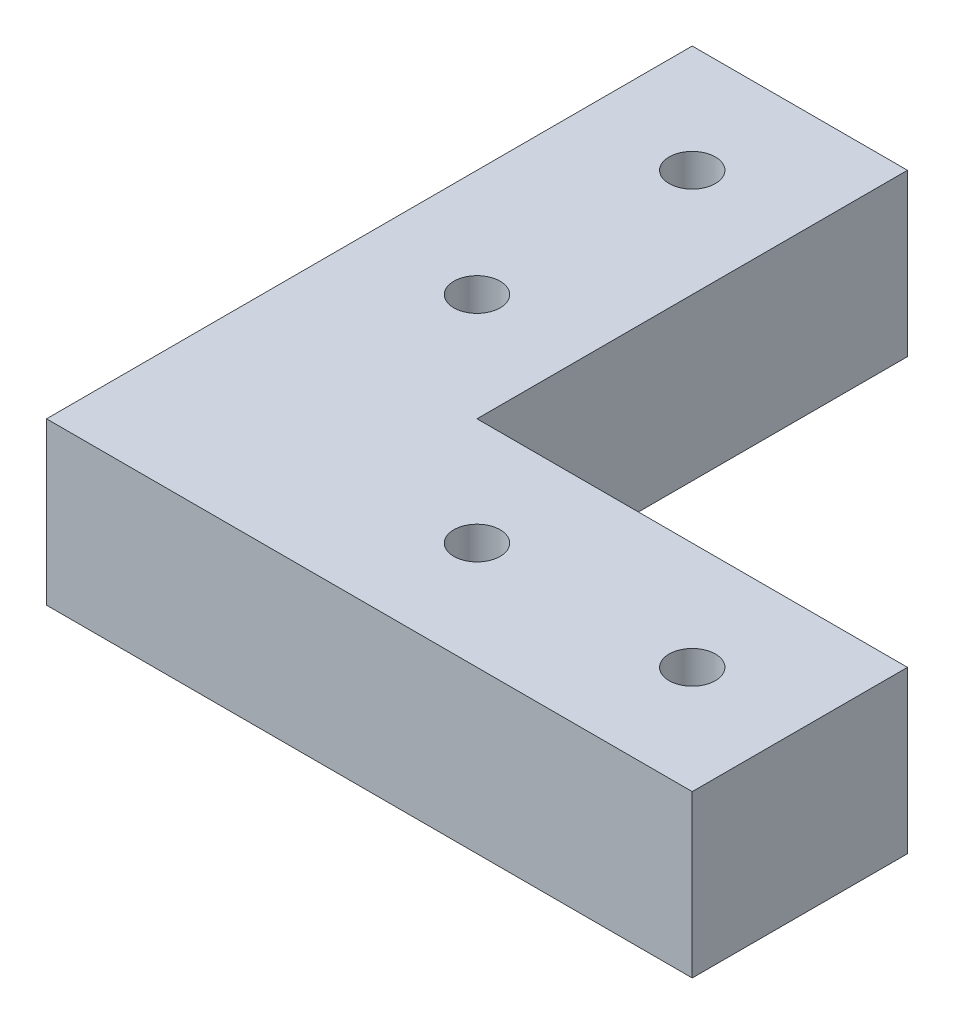
ISO-10303-21;
HEADER;
FILE_DESCRIPTION(('STEP AP214'),'2;1');
FILE_NAME('part.step','',(''),(''),'','','');
FILE_SCHEMA(('AUTOMOTIVE_DESIGN { 1 0 10303 214 1 1 1 1 }'));
ENDSEC;
DATA;
#1=APPLICATION_CONTEXT('core data for automotive mechanical design processes');
#2=APPLICATION_PROTOCOL_DEFINITION('international standard','automotive_design',2000,#1);
#3=PRODUCT_CONTEXT('',#1,'mechanical');
#4=PRODUCT('Part','Part','',(#3));
#5=PRODUCT_RELATED_PRODUCT_CATEGORY('part','',(#4));
#6=PRODUCT_DEFINITION_FORMATION('','',#4);
#7=PRODUCT_DEFINITION_CONTEXT('part definition',#1,'design');
#8=PRODUCT_DEFINITION('design','',#6,#7);
#9=PRODUCT_DEFINITION_SHAPE('','',#8);
#10=(LENGTH_UNIT() NAMED_UNIT(*) SI_UNIT(.MILLI.,.METRE.));
#11=(NAMED_UNIT(*) PLANE_ANGLE_UNIT() SI_UNIT($,.RADIAN.));
#12=(NAMED_UNIT(*) SI_UNIT($,.STERADIAN.) SOLID_ANGLE_UNIT());
#13=UNCERTAINTY_MEASURE_WITH_UNIT(LENGTH_MEASURE(1.E-05),#10,'distance_accuracy_value','');
#14=(GEOMETRIC_REPRESENTATION_CONTEXT(3) GLOBAL_UNCERTAINTY_ASSIGNED_CONTEXT((#13)) GLOBAL_UNIT_ASSIGNED_CONTEXT((#10,
#11,#12)) REPRESENTATION_CONTEXT('',''));
#15=CARTESIAN_POINT('',(0.,0.,0.));
#16=DIRECTION('',(0.,0.,1.));
#17=DIRECTION('',(1.,0.,0.));
#18=AXIS2_PLACEMENT_3D('',#15,#16,#17);
#19=CARTESIAN_POINT('',(0.,15.,0.));
#20=DIRECTION('',(0.,1.,0.));
#21=DIRECTION('',(0.,0.,1.));
#22=AXIS2_PLACEMENT_3D('',#19,#20,#21);
#23=PLANE('',#22);
#24=CARTESIAN_POINT('',(10.,15.,-50.));
#25=DIRECTION('',(0.,1.,0.));
#26=DIRECTION('',(0.,0.,1.));
#27=AXIS2_PLACEMENT_3D('',#24,#25,#26);
#28=CIRCLE('',#27,2.15);
#29=CARTESIAN_POINT('',(10.,15.,-47.85));
#30=VERTEX_POINT('',#29);
#31=EDGE_CURVE('E195',#30,#30,#28,.T.);
#32=ORIENTED_EDGE('',*,*,#31,.F.);
#33=EDGE_LOOP('',(#32));
#34=FACE_BOUND('',#33,.T.);
#35=CARTESIAN_POINT('',(50.,15.,-10.));
#36=DIRECTION('',(0.,1.,0.));
#37=DIRECTION('',(0.,0.,1.));
#38=AXIS2_PLACEMENT_3D('',#35,#36,#37);
#39=CIRCLE('',#38,2.15);
#40=CARTESIAN_POINT('',(50.,15.,-7.85));
#41=VERTEX_POINT('',#40);
#42=EDGE_CURVE('E128',#41,#41,#39,.T.);
#43=ORIENTED_EDGE('',*,*,#42,.F.);
#44=EDGE_LOOP('',(#43));
#45=FACE_BOUND('',#44,.T.);
#46=DIRECTION('',(0.,0.,1.));
#47=VECTOR('',#46,1.);
#48=CARTESIAN_POINT('',(0.,15.,-60.));
#49=LINE('',#48,#47);
#50=CARTESIAN_POINT('',(0.,15.,-60.));
#51=VERTEX_POINT('',#50);
#52=CARTESIAN_POINT('',(0.,15.,0.));
#53=VERTEX_POINT('',#52);
#54=EDGE_CURVE('E135',#51,#53,#49,.T.);
#55=ORIENTED_EDGE('',*,*,#54,.T.);
#56=DIRECTION('',(1.,0.,0.));
#57=VECTOR('',#56,1.);
#58=CARTESIAN_POINT('',(0.,15.,0.));
#59=LINE('',#58,#57);
#60=CARTESIAN_POINT('',(60.,15.,0.));
#61=VERTEX_POINT('',#60);
#62=EDGE_CURVE('E93',#53,#61,#59,.T.);
#63=ORIENTED_EDGE('',*,*,#62,.T.);
#64=DIRECTION('',(0.,0.,-1.));
#65=VECTOR('',#64,1.);
#66=CARTESIAN_POINT('',(60.,15.,0.));
#67=LINE('',#66,#65);
#68=CARTESIAN_POINT('',(60.,15.,-20.));
#69=VERTEX_POINT('',#68);
#70=EDGE_CURVE('E106',#61,#69,#67,.T.);
#71=ORIENTED_EDGE('',*,*,#70,.T.);
#72=DIRECTION('',(-1.,0.,0.));
#73=VECTOR('',#72,1.);
#74=CARTESIAN_POINT('',(60.,15.,-20.));
#75=LINE('',#74,#73);
#76=CARTESIAN_POINT('',(20.,15.,-20.));
#77=VERTEX_POINT('',#76);
#78=EDGE_CURVE('E100',#69,#77,#75,.T.);
#79=ORIENTED_EDGE('',*,*,#78,.T.);
#80=DIRECTION('',(0.,0.,-1.));
#81=VECTOR('',#80,1.);
#82=CARTESIAN_POINT('',(20.,15.,-20.));
#83=LINE('',#82,#81);
#84=CARTESIAN_POINT('',(20.,15.,-60.));
#85=VERTEX_POINT('',#84);
#86=EDGE_CURVE('E104',#77,#85,#83,.T.);
#87=ORIENTED_EDGE('',*,*,#86,.T.);
#88=DIRECTION('',(-1.,0.,0.));
#89=VECTOR('',#88,1.);
#90=CARTESIAN_POINT('',(20.,15.,-60.));
#91=LINE('',#90,#89);
#92=EDGE_CURVE('E56',#85,#51,#91,.T.);
#93=ORIENTED_EDGE('',*,*,#92,.T.);
#94=EDGE_LOOP('',(#55,#63,#71,#79,#87,#93));
#95=FACE_BOUND('',#94,.T.);
#96=CARTESIAN_POINT('',(30.,15.,-10.));
#97=DIRECTION('',(0.,1.,0.));
#98=DIRECTION('',(0.,0.,1.));
#99=AXIS2_PLACEMENT_3D('',#96,#97,#98);
#100=CIRCLE('',#99,2.15);
#101=CARTESIAN_POINT('',(30.,15.,-7.84999999999999));
#102=VERTEX_POINT('',#101);
#103=EDGE_CURVE('E201',#102,#102,#100,.T.);
#104=ORIENTED_EDGE('',*,*,#103,.F.);
#105=EDGE_LOOP('',(#104));
#106=FACE_BOUND('',#105,.T.);
#107=CARTESIAN_POINT('',(10.,15.,-30.));
#108=DIRECTION('',(0.,1.,0.));
#109=DIRECTION('',(0.,0.,1.));
#110=AXIS2_PLACEMENT_3D('',#107,#108,#109);
#111=CIRCLE('',#110,2.15);
#112=CARTESIAN_POINT('',(10.,15.,-27.85));
#113=VERTEX_POINT('',#112);
#114=EDGE_CURVE('E186',#113,#113,#111,.T.);
#115=ORIENTED_EDGE('',*,*,#114,.F.);
#116=EDGE_LOOP('',(#115));
#117=FACE_BOUND('',#116,.T.);
#118=ADVANCED_FACE('F39',(#34,#45,#95,#106,#117),#23,.T.);
#119=CARTESIAN_POINT('',(0.,0.,0.));
#120=DIRECTION('',(0.,1.,0.));
#121=DIRECTION('',(0.,0.,1.));
#122=AXIS2_PLACEMENT_3D('',#119,#120,#121);
#123=PLANE('',#122);
#124=DIRECTION('',(0.,0.,1.));
#125=VECTOR('',#124,1.);
#126=CARTESIAN_POINT('',(0.,0.,-60.));
#127=LINE('',#126,#125);
#128=CARTESIAN_POINT('',(0.,0.,-60.));
#129=VERTEX_POINT('',#128);
#130=CARTESIAN_POINT('',(0.,0.,0.));
#131=VERTEX_POINT('',#130);
#132=EDGE_CURVE('E124',#129,#131,#127,.T.);
#133=ORIENTED_EDGE('',*,*,#132,.F.);
#134=DIRECTION('',(-1.,0.,0.));
#135=VECTOR('',#134,1.);
#136=CARTESIAN_POINT('',(20.,0.,-60.));
#137=LINE('',#136,#135);
#138=CARTESIAN_POINT('',(20.,0.,-60.));
#139=VERTEX_POINT('',#138);
#140=EDGE_CURVE('E85',#139,#129,#137,.T.);
#141=ORIENTED_EDGE('',*,*,#140,.F.);
#142=DIRECTION('',(0.,0.,-1.));
#143=VECTOR('',#142,1.);
#144=CARTESIAN_POINT('',(20.,0.,-20.));
#145=LINE('',#144,#143);
#146=CARTESIAN_POINT('',(20.,0.,-20.));
#147=VERTEX_POINT('',#146);
#148=EDGE_CURVE('E79',#147,#139,#145,.T.);
#149=ORIENTED_EDGE('',*,*,#148,.F.);
#150=DIRECTION('',(-1.,0.,0.));
#151=VECTOR('',#150,1.);
#152=CARTESIAN_POINT('',(60.,0.,-20.));
#153=LINE('',#152,#151);
#154=CARTESIAN_POINT('',(60.,0.,-20.));
#155=VERTEX_POINT('',#154);
#156=EDGE_CURVE('E114',#155,#147,#153,.T.);
#157=ORIENTED_EDGE('',*,*,#156,.F.);
#158=DIRECTION('',(0.,0.,-1.));
#159=VECTOR('',#158,1.);
#160=CARTESIAN_POINT('',(60.,0.,0.));
#161=LINE('',#160,#159);
#162=CARTESIAN_POINT('',(60.,0.,0.));
#163=VERTEX_POINT('',#162);
#164=EDGE_CURVE('E130',#163,#155,#161,.T.);
#165=ORIENTED_EDGE('',*,*,#164,.F.);
#166=DIRECTION('',(1.,0.,0.));
#167=VECTOR('',#166,1.);
#168=CARTESIAN_POINT('',(0.,0.,0.));
#169=LINE('',#168,#167);
#170=EDGE_CURVE('E127',#131,#163,#169,.T.);
#171=ORIENTED_EDGE('',*,*,#170,.F.);
#172=EDGE_LOOP('',(#133,#141,#149,#157,#165,#171));
#173=FACE_BOUND('',#172,.T.);
#174=CARTESIAN_POINT('',(50.,0.,-10.));
#175=DIRECTION('',(0.,1.,0.));
#176=DIRECTION('',(0.,0.,1.));
#177=AXIS2_PLACEMENT_3D('',#174,#175,#176);
#178=CIRCLE('',#177,2.15);
#179=CARTESIAN_POINT('',(50.,0.,-7.85));
#180=VERTEX_POINT('',#179);
#181=EDGE_CURVE('E204',#180,#180,#178,.T.);
#182=ORIENTED_EDGE('',*,*,#181,.T.);
#183=EDGE_LOOP('',(#182));
#184=FACE_BOUND('',#183,.T.);
#185=CARTESIAN_POINT('',(30.,0.,-10.));
#186=DIRECTION('',(0.,1.,0.));
#187=DIRECTION('',(0.,0.,1.));
#188=AXIS2_PLACEMENT_3D('',#185,#186,#187);
#189=CIRCLE('',#188,2.15);
#190=CARTESIAN_POINT('',(30.,0.,-7.84999999999999));
#191=VERTEX_POINT('',#190);
#192=EDGE_CURVE('E198',#191,#191,#189,.T.);
#193=ORIENTED_EDGE('',*,*,#192,.T.);
#194=EDGE_LOOP('',(#193));
#195=FACE_BOUND('',#194,.T.);
#196=CARTESIAN_POINT('',(10.,0.,-50.));
#197=DIRECTION('',(0.,1.,0.));
#198=DIRECTION('',(0.,0.,1.));
#199=AXIS2_PLACEMENT_3D('',#196,#197,#198);
#200=CIRCLE('',#199,2.15);
#201=CARTESIAN_POINT('',(10.,0.,-47.85));
#202=VERTEX_POINT('',#201);
#203=EDGE_CURVE('E192',#202,#202,#200,.T.);
#204=ORIENTED_EDGE('',*,*,#203,.T.);
#205=EDGE_LOOP('',(#204));
#206=FACE_BOUND('',#205,.T.);
#207=CARTESIAN_POINT('',(10.,0.,-30.));
#208=DIRECTION('',(0.,1.,0.));
#209=DIRECTION('',(0.,0.,1.));
#210=AXIS2_PLACEMENT_3D('',#207,#208,#209);
#211=CIRCLE('',#210,2.15);
#212=CARTESIAN_POINT('',(10.,0.,-27.85));
#213=VERTEX_POINT('',#212);
#214=EDGE_CURVE('E189',#213,#213,#211,.T.);
#215=ORIENTED_EDGE('',*,*,#214,.T.);
#216=EDGE_LOOP('',(#215));
#217=FACE_BOUND('',#216,.T.);
#218=ADVANCED_FACE('F144',(#173,#184,#195,#206,#217),#123,.F.);
#219=CARTESIAN_POINT('',(0.,15.,-60.));
#220=DIRECTION('',(1.,0.,0.));
#221=DIRECTION('',(0.,0.,-1.));
#222=AXIS2_PLACEMENT_3D('',#219,#220,#221);
#223=PLANE('',#222);
#224=ORIENTED_EDGE('',*,*,#132,.T.);
#225=DIRECTION('',(0.,-1.,0.));
#226=VECTOR('',#225,1.);
#227=CARTESIAN_POINT('',(0.,15.,0.));
#228=LINE('',#227,#226);
#229=EDGE_CURVE('E11',#53,#131,#228,.T.);
#230=ORIENTED_EDGE('',*,*,#229,.F.);
#231=ORIENTED_EDGE('',*,*,#54,.F.);
#232=DIRECTION('',(0.,-1.,0.));
#233=VECTOR('',#232,1.);
#234=CARTESIAN_POINT('',(0.,15.,-60.));
#235=LINE('',#234,#233);
#236=EDGE_CURVE('E120',#51,#129,#235,.T.);
#237=ORIENTED_EDGE('',*,*,#236,.T.);
#238=EDGE_LOOP('',(#224,#230,#231,#237));
#239=FACE_BOUND('',#238,.T.);
#240=ADVANCED_FACE('F41',(#239),#223,.F.);
#241=CARTESIAN_POINT('',(0.,15.,0.));
#242=DIRECTION('',(0.,0.,-1.));
#243=DIRECTION('',(-1.,0.,0.));
#244=AXIS2_PLACEMENT_3D('',#241,#242,#243);
#245=PLANE('',#244);
#246=ORIENTED_EDGE('',*,*,#170,.T.);
#247=DIRECTION('',(0.,-1.,0.));
#248=VECTOR('',#247,1.);
#249=CARTESIAN_POINT('',(60.,15.,0.));
#250=LINE('',#249,#248);
#251=EDGE_CURVE('E48',#61,#163,#250,.T.);
#252=ORIENTED_EDGE('',*,*,#251,.F.);
#253=ORIENTED_EDGE('',*,*,#62,.F.);
#254=ORIENTED_EDGE('',*,*,#229,.T.);
#255=EDGE_LOOP('',(#246,#252,#253,#254));
#256=FACE_BOUND('',#255,.T.);
#257=ADVANCED_FACE('F254',(#256),#245,.F.);
#258=CARTESIAN_POINT('',(60.,15.,0.));
#259=DIRECTION('',(-1.,0.,0.));
#260=DIRECTION('',(0.,0.,1.));
#261=AXIS2_PLACEMENT_3D('',#258,#259,#260);
#262=PLANE('',#261);
#263=ORIENTED_EDGE('',*,*,#164,.T.);
#264=DIRECTION('',(0.,-1.,0.));
#265=VECTOR('',#264,1.);
#266=CARTESIAN_POINT('',(60.,15.,-20.));
#267=LINE('',#266,#265);
#268=EDGE_CURVE('E115',#69,#155,#267,.T.);
#269=ORIENTED_EDGE('',*,*,#268,.F.);
#270=ORIENTED_EDGE('',*,*,#70,.F.);
#271=ORIENTED_EDGE('',*,*,#251,.T.);
#272=EDGE_LOOP('',(#263,#269,#270,#271));
#273=FACE_BOUND('',#272,.T.);
#274=ADVANCED_FACE('F141',(#273),#262,.F.);
#275=CARTESIAN_POINT('',(60.,15.,-20.));
#276=DIRECTION('',(0.,0.,1.));
#277=DIRECTION('',(1.,0.,0.));
#278=AXIS2_PLACEMENT_3D('',#275,#276,#277);
#279=PLANE('',#278);
#280=ORIENTED_EDGE('',*,*,#156,.T.);
#281=DIRECTION('',(0.,-1.,0.));
#282=VECTOR('',#281,1.);
#283=CARTESIAN_POINT('',(20.,15.,-20.));
#284=LINE('',#283,#282);
#285=EDGE_CURVE('E111',#77,#147,#284,.T.);
#286=ORIENTED_EDGE('',*,*,#285,.F.);
#287=ORIENTED_EDGE('',*,*,#78,.F.);
#288=ORIENTED_EDGE('',*,*,#268,.T.);
#289=EDGE_LOOP('',(#280,#286,#287,#288));
#290=FACE_BOUND('',#289,.T.);
#291=ADVANCED_FACE('F112',(#290),#279,.F.);
#292=CARTESIAN_POINT('',(20.,15.,-20.));
#293=DIRECTION('',(-1.,0.,0.));
#294=DIRECTION('',(0.,0.,1.));
#295=AXIS2_PLACEMENT_3D('',#292,#293,#294);
#296=PLANE('',#295);
#297=ORIENTED_EDGE('',*,*,#148,.T.);
#298=DIRECTION('',(0.,-1.,0.));
#299=VECTOR('',#298,1.);
#300=CARTESIAN_POINT('',(20.,15.,-60.));
#301=LINE('',#300,#299);
#302=EDGE_CURVE('E116',#85,#139,#301,.T.);
#303=ORIENTED_EDGE('',*,*,#302,.F.);
#304=ORIENTED_EDGE('',*,*,#86,.F.);
#305=ORIENTED_EDGE('',*,*,#285,.T.);
#306=EDGE_LOOP('',(#297,#303,#304,#305));
#307=FACE_BOUND('',#306,.T.);
#308=ADVANCED_FACE('F118',(#307),#296,.F.);
#309=CARTESIAN_POINT('',(20.,15.,-60.));
#310=DIRECTION('',(0.,0.,1.));
#311=DIRECTION('',(1.,0.,0.));
#312=AXIS2_PLACEMENT_3D('',#309,#310,#311);
#313=PLANE('',#312);
#314=ORIENTED_EDGE('',*,*,#140,.T.);
#315=ORIENTED_EDGE('',*,*,#236,.F.);
#316=ORIENTED_EDGE('',*,*,#92,.F.);
#317=ORIENTED_EDGE('',*,*,#302,.T.);
#318=EDGE_LOOP('',(#314,#315,#316,#317));
#319=FACE_BOUND('',#318,.T.);
#320=ADVANCED_FACE('F149',(#319),#313,.F.);
#321=CARTESIAN_POINT('',(50.,15.,-10.));
#322=DIRECTION('',(0.,-1.,0.));
#323=DIRECTION('',(0.,0.,-1.));
#324=AXIS2_PLACEMENT_3D('',#321,#322,#323);
#325=CYLINDRICAL_SURFACE('',#324,2.15);
#326=ORIENTED_EDGE('',*,*,#42,.T.);
#327=EDGE_LOOP('',(#326));
#328=FACE_BOUND('',#327,.T.);
#329=ORIENTED_EDGE('',*,*,#181,.F.);
#330=EDGE_LOOP('',(#329));
#331=FACE_BOUND('',#330,.T.);
#332=ADVANCED_FACE('F151',(#328,#331),#325,.F.);
#333=CARTESIAN_POINT('',(30.,15.,-10.));
#334=DIRECTION('',(0.,-1.,0.));
#335=DIRECTION('',(0.,0.,-1.));
#336=AXIS2_PLACEMENT_3D('',#333,#334,#335);
#337=CYLINDRICAL_SURFACE('',#336,2.15);
#338=ORIENTED_EDGE('',*,*,#103,.T.);
#339=EDGE_LOOP('',(#338));
#340=FACE_BOUND('',#339,.T.);
#341=ORIENTED_EDGE('',*,*,#192,.F.);
#342=EDGE_LOOP('',(#341));
#343=FACE_BOUND('',#342,.T.);
#344=ADVANCED_FACE('F157',(#340,#343),#337,.F.);
#345=CARTESIAN_POINT('',(10.,15.,-50.));
#346=DIRECTION('',(0.,-1.,0.));
#347=DIRECTION('',(0.,0.,-1.));
#348=AXIS2_PLACEMENT_3D('',#345,#346,#347);
#349=CYLINDRICAL_SURFACE('',#348,2.15);
#350=ORIENTED_EDGE('',*,*,#31,.T.);
#351=EDGE_LOOP('',(#350));
#352=FACE_BOUND('',#351,.T.);
#353=ORIENTED_EDGE('',*,*,#203,.F.);
#354=EDGE_LOOP('',(#353));
#355=FACE_BOUND('',#354,.T.);
#356=ADVANCED_FACE('F173',(#352,#355),#349,.F.);
#357=CARTESIAN_POINT('',(10.,15.,-30.));
#358=DIRECTION('',(0.,-1.,0.));
#359=DIRECTION('',(0.,0.,-1.));
#360=AXIS2_PLACEMENT_3D('',#357,#358,#359);
#361=CYLINDRICAL_SURFACE('',#360,2.15);
#362=ORIENTED_EDGE('',*,*,#114,.T.);
#363=EDGE_LOOP('',(#362));
#364=FACE_BOUND('',#363,.T.);
#365=ORIENTED_EDGE('',*,*,#214,.F.);
#366=EDGE_LOOP('',(#365));
#367=FACE_BOUND('',#366,.T.);
#368=ADVANCED_FACE('F177',(#364,#367),#361,.F.);
#369=CLOSED_SHELL('',(#118,#218,#240,#257,#274,#291,#308,#320,#332,#344,#356,#368));
#370=MANIFOLD_SOLID_BREP('B2',#369);
#371=ADVANCED_BREP_SHAPE_REPRESENTATION('',(#18,#370),#14);
#372=SHAPE_DEFINITION_REPRESENTATION(#9,#371);
ENDSEC;
END-ISO-10303-21;
